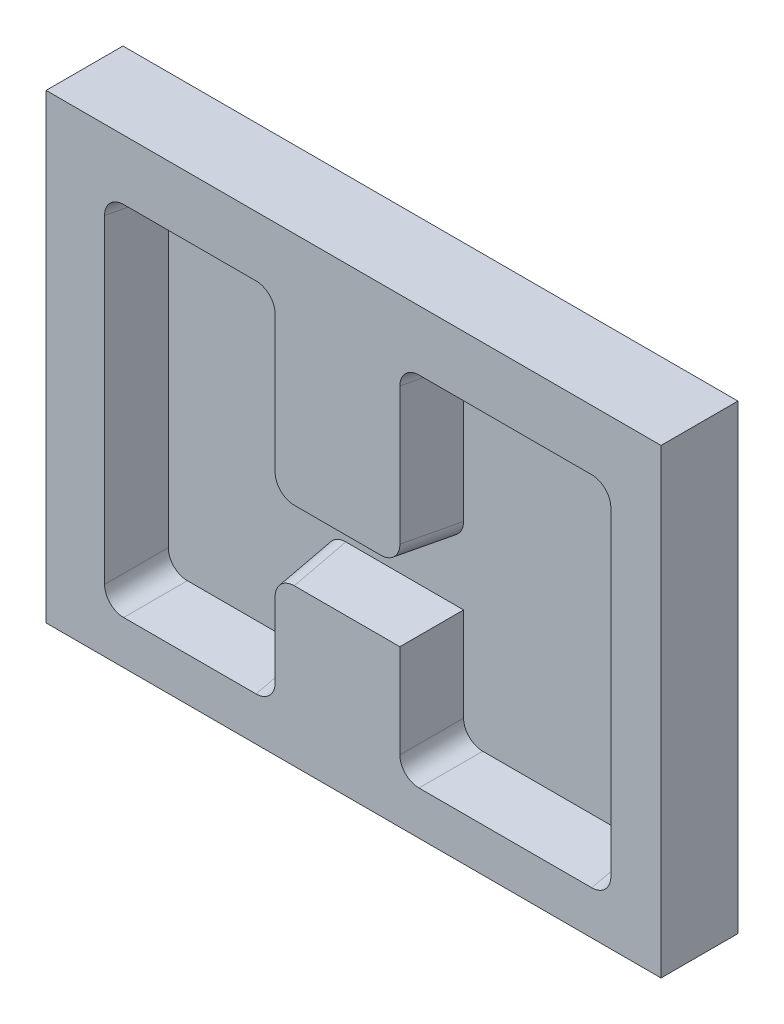
ISO-10303-21;
HEADER;
FILE_DESCRIPTION(('STEP AP214'),'2;1');
FILE_NAME('part.step','',(''),(''),'','','');
FILE_SCHEMA(('AUTOMOTIVE_DESIGN { 1 0 10303 214 1 1 1 1 }'));
ENDSEC;
DATA;
#1=APPLICATION_CONTEXT('core data for automotive mechanical design processes');
#2=APPLICATION_PROTOCOL_DEFINITION('international standard','automotive_design',2000,#1);
#3=PRODUCT_CONTEXT('',#1,'mechanical');
#4=PRODUCT('Part','Part','',(#3));
#5=PRODUCT_RELATED_PRODUCT_CATEGORY('part','',(#4));
#6=PRODUCT_DEFINITION_FORMATION('','',#4);
#7=PRODUCT_DEFINITION_CONTEXT('part definition',#1,'design');
#8=PRODUCT_DEFINITION('design','',#6,#7);
#9=PRODUCT_DEFINITION_SHAPE('','',#8);
#10=(LENGTH_UNIT() NAMED_UNIT(*) SI_UNIT(.MILLI.,.METRE.));
#11=(NAMED_UNIT(*) PLANE_ANGLE_UNIT() SI_UNIT($,.RADIAN.));
#12=(NAMED_UNIT(*) SI_UNIT($,.STERADIAN.) SOLID_ANGLE_UNIT());
#13=UNCERTAINTY_MEASURE_WITH_UNIT(LENGTH_MEASURE(1.E-05),#10,'distance_accuracy_value','');
#14=(GEOMETRIC_REPRESENTATION_CONTEXT(3) GLOBAL_UNCERTAINTY_ASSIGNED_CONTEXT((#13)) GLOBAL_UNIT_ASSIGNED_CONTEXT((#10,
#11,#12)) REPRESENTATION_CONTEXT('',''));
#15=CARTESIAN_POINT('',(0.,0.,0.));
#16=DIRECTION('',(0.,0.,1.));
#17=DIRECTION('',(1.,0.,0.));
#18=AXIS2_PLACEMENT_3D('',#15,#16,#17);
#19=CARTESIAN_POINT('',(0.,0.,25.4));
#20=DIRECTION('',(1.,0.,0.));
#21=DIRECTION('',(0.,0.,-1.));
#22=AXIS2_PLACEMENT_3D('',#19,#20,#21);
#23=PLANE('',#22);
#24=DIRECTION('',(0.,-1.,0.));
#25=VECTOR('',#24,1.);
#26=CARTESIAN_POINT('',(0.,0.,0.));
#27=LINE('',#26,#25);
#28=CARTESIAN_POINT('',(0.,152.4,0.));
#29=VERTEX_POINT('',#28);
#30=CARTESIAN_POINT('',(0.,0.,0.));
#31=VERTEX_POINT('',#30);
#32=EDGE_CURVE('E236',#29,#31,#27,.T.);
#33=ORIENTED_EDGE('',*,*,#32,.T.);
#34=DIRECTION('',(0.,0.,-1.));
#35=VECTOR('',#34,1.);
#36=CARTESIAN_POINT('',(0.,0.,25.4));
#37=LINE('',#36,#35);
#38=CARTESIAN_POINT('',(0.,0.,25.4));
#39=VERTEX_POINT('',#38);
#40=EDGE_CURVE('E324',#39,#31,#37,.T.);
#41=ORIENTED_EDGE('',*,*,#40,.F.);
#42=DIRECTION('',(0.,-1.,0.));
#43=VECTOR('',#42,1.);
#44=CARTESIAN_POINT('',(0.,0.,25.4));
#45=LINE('',#44,#43);
#46=CARTESIAN_POINT('',(0.,152.4,25.4));
#47=VERTEX_POINT('',#46);
#48=EDGE_CURVE('E306',#47,#39,#45,.T.);
#49=ORIENTED_EDGE('',*,*,#48,.F.);
#50=DIRECTION('',(0.,0.,-1.));
#51=VECTOR('',#50,1.);
#52=CARTESIAN_POINT('',(0.,152.4,25.4));
#53=LINE('',#52,#51);
#54=EDGE_CURVE('E315',#47,#29,#53,.T.);
#55=ORIENTED_EDGE('',*,*,#54,.T.);
#56=EDGE_LOOP('',(#33,#41,#49,#55));
#57=FACE_BOUND('',#56,.T.);
#58=ADVANCED_FACE('F38',(#57),#23,.F.);
#59=CARTESIAN_POINT('',(0.,0.,25.4));
#60=DIRECTION('',(0.,1.,0.));
#61=DIRECTION('',(0.,0.,1.));
#62=AXIS2_PLACEMENT_3D('',#59,#60,#61);
#63=PLANE('',#62);
#64=DIRECTION('',(1.,0.,0.));
#65=VECTOR('',#64,1.);
#66=CARTESIAN_POINT('',(0.,0.,0.));
#67=LINE('',#66,#65);
#68=CARTESIAN_POINT('',(203.2,0.,0.));
#69=VERTEX_POINT('',#68);
#70=EDGE_CURVE('E300',#31,#69,#67,.T.);
#71=ORIENTED_EDGE('',*,*,#70,.T.);
#72=DIRECTION('',(0.,0.,-1.));
#73=VECTOR('',#72,1.);
#74=CARTESIAN_POINT('',(203.2,0.,25.4));
#75=LINE('',#74,#73);
#76=CARTESIAN_POINT('',(203.2,0.,25.4));
#77=VERTEX_POINT('',#76);
#78=EDGE_CURVE('E321',#77,#69,#75,.T.);
#79=ORIENTED_EDGE('',*,*,#78,.F.);
#80=DIRECTION('',(1.,0.,0.));
#81=VECTOR('',#80,1.);
#82=CARTESIAN_POINT('',(0.,0.,25.4));
#83=LINE('',#82,#81);
#84=EDGE_CURVE('E309',#39,#77,#83,.T.);
#85=ORIENTED_EDGE('',*,*,#84,.F.);
#86=ORIENTED_EDGE('',*,*,#40,.T.);
#87=EDGE_LOOP('',(#71,#79,#85,#86));
#88=FACE_BOUND('',#87,.T.);
#89=ADVANCED_FACE('F510',(#88),#63,.F.);
#90=CARTESIAN_POINT('',(203.2,0.,25.4));
#91=DIRECTION('',(-1.,0.,0.));
#92=DIRECTION('',(0.,0.,1.));
#93=AXIS2_PLACEMENT_3D('',#90,#91,#92);
#94=PLANE('',#93);
#95=DIRECTION('',(0.,1.,0.));
#96=VECTOR('',#95,1.);
#97=CARTESIAN_POINT('',(203.2,0.,0.));
#98=LINE('',#97,#96);
#99=CARTESIAN_POINT('',(203.2,152.4,0.));
#100=VERTEX_POINT('',#99);
#101=EDGE_CURVE('E302',#69,#100,#98,.T.);
#102=ORIENTED_EDGE('',*,*,#101,.T.);
#103=DIRECTION('',(0.,0.,-1.));
#104=VECTOR('',#103,1.);
#105=CARTESIAN_POINT('',(203.2,152.4,25.4));
#106=LINE('',#105,#104);
#107=CARTESIAN_POINT('',(203.2,152.4,25.4));
#108=VERTEX_POINT('',#107);
#109=EDGE_CURVE('E318',#108,#100,#106,.T.);
#110=ORIENTED_EDGE('',*,*,#109,.F.);
#111=DIRECTION('',(0.,1.,0.));
#112=VECTOR('',#111,1.);
#113=CARTESIAN_POINT('',(203.2,0.,25.4));
#114=LINE('',#113,#112);
#115=EDGE_CURVE('E311',#77,#108,#114,.T.);
#116=ORIENTED_EDGE('',*,*,#115,.F.);
#117=ORIENTED_EDGE('',*,*,#78,.T.);
#118=EDGE_LOOP('',(#102,#110,#116,#117));
#119=FACE_BOUND('',#118,.T.);
#120=ADVANCED_FACE('F515',(#119),#94,.F.);
#121=CARTESIAN_POINT('',(0.,152.4,25.4));
#122=DIRECTION('',(0.,-1.,0.));
#123=DIRECTION('',(0.,0.,-1.));
#124=AXIS2_PLACEMENT_3D('',#121,#122,#123);
#125=PLANE('',#124);
#126=DIRECTION('',(-1.,0.,0.));
#127=VECTOR('',#126,1.);
#128=CARTESIAN_POINT('',(0.,152.4,0.));
#129=LINE('',#128,#127);
#130=EDGE_CURVE('E304',#100,#29,#129,.T.);
#131=ORIENTED_EDGE('',*,*,#130,.T.);
#132=ORIENTED_EDGE('',*,*,#54,.F.);
#133=DIRECTION('',(-1.,0.,0.));
#134=VECTOR('',#133,1.);
#135=CARTESIAN_POINT('',(0.,152.4,25.4));
#136=LINE('',#135,#134);
#137=EDGE_CURVE('E313',#108,#47,#136,.T.);
#138=ORIENTED_EDGE('',*,*,#137,.F.);
#139=ORIENTED_EDGE('',*,*,#109,.T.);
#140=EDGE_LOOP('',(#131,#132,#138,#139));
#141=FACE_BOUND('',#140,.T.);
#142=ADVANCED_FACE('F530',(#141),#125,.F.);
#143=CARTESIAN_POINT('',(0.,152.4,25.4));
#144=DIRECTION('',(0.,0.,-1.));
#145=DIRECTION('',(-1.,0.,0.));
#146=AXIS2_PLACEMENT_3D('',#143,#144,#145);
#147=PLANE('',#146);
#148=DIRECTION('',(1.,0.,0.));
#149=VECTOR('',#148,1.);
#150=CARTESIAN_POINT('',(116.904399701715,51.6523489932887,25.4));
#151=LINE('',#150,#149);
#152=CARTESIAN_POINT('',(82.0038046396154,51.6523489932887,25.4));
#153=VERTEX_POINT('',#152);
#154=CARTESIAN_POINT('',(116.904399701715,51.6523489932887,25.4));
#155=VERTEX_POINT('',#154);
#156=EDGE_CURVE('E218',#153,#155,#151,.T.);
#157=ORIENTED_EDGE('',*,*,#156,.F.);
#158=CARTESIAN_POINT('',(82.0735681792552,45.2673714180604,25.4));
#159=DIRECTION('',(0.,0.,-1.));
#160=DIRECTION('',(0.707106781186547,-0.707106781186548,0.));
#161=AXIS2_PLACEMENT_3D('',#158,#159,#160);
#162=ELLIPSE('',#161,6.41976458075662,6.35);
#163=CARTESIAN_POINT('',(75.6885906040269,45.3371349577002,25.4));
#164=VERTEX_POINT('',#163);
#165=EDGE_CURVE('E380',#153,#164,#162,.F.);
#166=ORIENTED_EDGE('',*,*,#165,.T.);
#167=DIRECTION('',(0.,1.,0.));
#168=VECTOR('',#167,1.);
#169=CARTESIAN_POINT('',(75.6885906040269,51.6523489932887,25.4));
#170=LINE('',#169,#168);
#171=CARTESIAN_POINT('',(75.6885906040269,20.6915003890562,25.4));
#172=VERTEX_POINT('',#171);
#173=EDGE_CURVE('E228',#172,#164,#170,.T.);
#174=ORIENTED_EDGE('',*,*,#173,.F.);
#175=CARTESIAN_POINT('',(69.3036130287986,20.761263928696,25.4));
#176=DIRECTION('',(0.,0.,-1.));
#177=DIRECTION('',(-0.707106781186548,0.707106781186547,0.));
#178=AXIS2_PLACEMENT_3D('',#175,#176,#177);
#179=ELLIPSE('',#178,6.41976458075662,6.35);
#180=CARTESIAN_POINT('',(69.3733765684383,14.3762863534677,25.4));
#181=VERTEX_POINT('',#180);
#182=EDGE_CURVE('E406',#172,#181,#179,.T.);
#183=ORIENTED_EDGE('',*,*,#182,.T.);
#184=DIRECTION('',(1.,0.,0.));
#185=VECTOR('',#184,1.);
#186=CARTESIAN_POINT('',(75.6885906040269,14.3762863534677,25.4));
#187=LINE('',#186,#185);
#188=CARTESIAN_POINT('',(25.6351245501299,14.3762863534677,25.4));
#189=VERTEX_POINT('',#188);
#190=EDGE_CURVE('E476',#189,#181,#187,.T.);
#191=ORIENTED_EDGE('',*,*,#190,.F.);
#192=CARTESIAN_POINT('',(25.7048880897697,20.761263928696,25.4));
#193=DIRECTION('',(0.,0.,-1.));
#194=DIRECTION('',(0.707106781186548,0.707106781186548,0.));
#195=AXIS2_PLACEMENT_3D('',#192,#193,#194);
#196=ELLIPSE('',#195,6.41976458075662,6.35);
#197=CARTESIAN_POINT('',(19.3199105145414,20.6915003890562,25.4));
#198=VERTEX_POINT('',#197);
#199=EDGE_CURVE('E404',#189,#198,#196,.T.);
#200=ORIENTED_EDGE('',*,*,#199,.T.);
#201=DIRECTION('',(0.,-1.,0.));
#202=VECTOR('',#201,1.);
#203=CARTESIAN_POINT('',(19.3199105145414,132.568680089486,25.4));
#204=LINE('',#203,#202);
#205=CARTESIAN_POINT('',(19.3199105145414,126.253466053897,25.4));
#206=VERTEX_POINT('',#205);
#207=EDGE_CURVE('E478',#206,#198,#204,.T.);
#208=ORIENTED_EDGE('',*,*,#207,.F.);
#209=CARTESIAN_POINT('',(25.7048880897697,126.183702514257,25.4));
#210=DIRECTION('',(0.,0.,-1.));
#211=DIRECTION('',(0.707106781186548,-0.707106781186548,0.));
#212=AXIS2_PLACEMENT_3D('',#209,#210,#211);
#213=ELLIPSE('',#212,6.41976458075662,6.35);
#214=CARTESIAN_POINT('',(25.6351245501299,132.568680089486,25.4));
#215=VERTEX_POINT('',#214);
#216=EDGE_CURVE('E11',#206,#215,#213,.T.);
#217=ORIENTED_EDGE('',*,*,#216,.T.);
#218=DIRECTION('',(-1.,0.,0.));
#219=VECTOR('',#218,1.);
#220=CARTESIAN_POINT('',(19.3199105145414,132.568680089486,25.4));
#221=LINE('',#220,#219);
#222=CARTESIAN_POINT('',(69.3733765684383,132.568680089486,25.4));
#223=VERTEX_POINT('',#222);
#224=EDGE_CURVE('E263',#223,#215,#221,.T.);
#225=ORIENTED_EDGE('',*,*,#224,.F.);
#226=CARTESIAN_POINT('',(69.3036130287985,126.183702514257,25.4));
#227=DIRECTION('',(0.,0.,-1.));
#228=DIRECTION('',(-0.707106781186548,-0.707106781186548,0.));
#229=AXIS2_PLACEMENT_3D('',#226,#227,#228);
#230=ELLIPSE('',#229,6.41976458075662,6.35);
#231=CARTESIAN_POINT('',(75.6885906040269,126.253466053897,25.4));
#232=VERTEX_POINT('',#231);
#233=EDGE_CURVE('E402',#223,#232,#230,.T.);
#234=ORIENTED_EDGE('',*,*,#233,.T.);
#235=DIRECTION('',(0.,1.,0.));
#236=VECTOR('',#235,1.);
#237=CARTESIAN_POINT('',(75.6885906040269,132.568680089486,25.4));
#238=LINE('',#237,#236);
#239=CARTESIAN_POINT('',(75.6885906040269,80.9999269364089,25.4));
#240=VERTEX_POINT('',#239);
#241=EDGE_CURVE('E260',#240,#232,#238,.T.);
#242=ORIENTED_EDGE('',*,*,#241,.F.);
#243=CARTESIAN_POINT('',(82.0735681792552,81.0696904760487,25.4));
#244=DIRECTION('',(0.,0.,-1.));
#245=DIRECTION('',(0.707106781186548,0.707106781186548,0.));
#246=AXIS2_PLACEMENT_3D('',#243,#244,#245);
#247=ELLIPSE('',#246,6.41976458075662,6.35);
#248=CARTESIAN_POINT('',(82.0038046396154,74.6847129008204,25.4));
#249=VERTEX_POINT('',#248);
#250=EDGE_CURVE('E376',#240,#249,#247,.F.);
#251=ORIENTED_EDGE('',*,*,#250,.T.);
#252=DIRECTION('',(-1.,0.,0.));
#253=VECTOR('',#252,1.);
#254=CARTESIAN_POINT('',(75.6885906040269,74.6847129008204,25.4));
#255=LINE('',#254,#253);
#256=CARTESIAN_POINT('',(110.589185666127,74.6847129008204,25.4));
#257=VERTEX_POINT('',#256);
#258=EDGE_CURVE('E257',#257,#249,#255,.T.);
#259=ORIENTED_EDGE('',*,*,#258,.F.);
#260=CARTESIAN_POINT('',(110.519422126487,81.0696904760487,25.4));
#261=DIRECTION('',(0.,0.,-1.));
#262=DIRECTION('',(-0.707106781186547,0.707106781186548,0.));
#263=AXIS2_PLACEMENT_3D('',#260,#261,#262);
#264=ELLIPSE('',#263,6.41976458075662,6.35);
#265=CARTESIAN_POINT('',(116.904399701715,80.9999269364089,25.4));
#266=VERTEX_POINT('',#265);
#267=EDGE_CURVE('E378',#257,#266,#264,.F.);
#268=ORIENTED_EDGE('',*,*,#267,.T.);
#269=DIRECTION('',(0.,-1.,0.));
#270=VECTOR('',#269,1.);
#271=CARTESIAN_POINT('',(116.904399701715,74.6847129008204,25.4));
#272=LINE('',#271,#270);
#273=CARTESIAN_POINT('',(116.904399701715,126.253466053897,25.4));
#274=VERTEX_POINT('',#273);
#275=EDGE_CURVE('E254',#274,#266,#272,.T.);
#276=ORIENTED_EDGE('',*,*,#275,.F.);
#277=CARTESIAN_POINT('',(123.289377276943,126.183702514257,25.4));
#278=DIRECTION('',(0.,0.,-1.));
#279=DIRECTION('',(0.707106781186547,-0.707106781186548,0.));
#280=AXIS2_PLACEMENT_3D('',#277,#278,#279);
#281=ELLIPSE('',#280,6.41976458075662,6.35);
#282=CARTESIAN_POINT('',(123.219613737304,132.568680089486,25.4));
#283=VERTEX_POINT('',#282);
#284=EDGE_CURVE('E412',#274,#283,#281,.T.);
#285=ORIENTED_EDGE('',*,*,#284,.T.);
#286=DIRECTION('',(-1.,0.,0.));
#287=VECTOR('',#286,1.);
#288=CARTESIAN_POINT('',(116.904399701715,132.568680089486,25.4));
#289=LINE('',#288,#287);
#290=CARTESIAN_POINT('',(180.292392228393,132.568680089486,25.4));
#291=VERTEX_POINT('',#290);
#292=EDGE_CURVE('E251',#291,#283,#289,.T.);
#293=ORIENTED_EDGE('',*,*,#292,.F.);
#294=CARTESIAN_POINT('',(180.222628688754,126.183702514257,25.4));
#295=DIRECTION('',(0.,0.,-1.));
#296=DIRECTION('',(-0.707106781186548,-0.707106781186548,0.));
#297=AXIS2_PLACEMENT_3D('',#294,#295,#296);
#298=ELLIPSE('',#297,6.41976458075662,6.35);
#299=CARTESIAN_POINT('',(186.607606263982,126.253466053897,25.4));
#300=VERTEX_POINT('',#299);
#301=EDGE_CURVE('E52',#291,#300,#298,.T.);
#302=ORIENTED_EDGE('',*,*,#301,.T.);
#303=DIRECTION('',(0.,1.,0.));
#304=VECTOR('',#303,1.);
#305=CARTESIAN_POINT('',(186.607606263982,132.568680089486,25.4));
#306=LINE('',#305,#304);
#307=CARTESIAN_POINT('',(186.607606263982,20.6915003890562,25.4));
#308=VERTEX_POINT('',#307);
#309=EDGE_CURVE('E246',#308,#300,#306,.T.);
#310=ORIENTED_EDGE('',*,*,#309,.F.);
#311=CARTESIAN_POINT('',(180.222628688754,20.761263928696,25.4));
#312=DIRECTION('',(0.,0.,-1.));
#313=DIRECTION('',(-0.707106781186548,0.707106781186548,0.));
#314=AXIS2_PLACEMENT_3D('',#311,#312,#313);
#315=ELLIPSE('',#314,6.41976458075662,6.35);
#316=CARTESIAN_POINT('',(180.292392228394,14.3762863534677,25.4));
#317=VERTEX_POINT('',#316);
#318=EDGE_CURVE('E60',#308,#317,#315,.T.);
#319=ORIENTED_EDGE('',*,*,#318,.T.);
#320=DIRECTION('',(1.,0.,0.));
#321=VECTOR('',#320,1.);
#322=CARTESIAN_POINT('',(186.607606263982,14.3762863534677,25.4));
#323=LINE('',#322,#321);
#324=CARTESIAN_POINT('',(123.219613737304,14.3762863534677,25.4));
#325=VERTEX_POINT('',#324);
#326=EDGE_CURVE('E243',#325,#317,#323,.T.);
#327=ORIENTED_EDGE('',*,*,#326,.F.);
#328=CARTESIAN_POINT('',(123.289377276943,20.761263928696,25.4));
#329=DIRECTION('',(0.,0.,-1.));
#330=DIRECTION('',(0.707106781186548,0.707106781186548,0.));
#331=AXIS2_PLACEMENT_3D('',#328,#329,#330);
#332=ELLIPSE('',#331,6.41976458075662,6.35);
#333=CARTESIAN_POINT('',(116.904399701715,20.6915003890562,25.4));
#334=VERTEX_POINT('',#333);
#335=EDGE_CURVE('E242',#325,#334,#332,.T.);
#336=ORIENTED_EDGE('',*,*,#335,.T.);
#337=DIRECTION('',(0.,-1.,0.));
#338=VECTOR('',#337,1.);
#339=CARTESIAN_POINT('',(116.904399701715,14.3762863534677,25.4));
#340=LINE('',#339,#338);
#341=EDGE_CURVE('E227',#155,#334,#340,.T.);
#342=ORIENTED_EDGE('',*,*,#341,.F.);
#343=EDGE_LOOP('',(#157,#166,#174,#183,#191,#200,#208,#217,#225,#234,#242,#251,#259,#268,#276,
#285,#293,#302,#310,#319,#327,#336,#342));
#344=FACE_BOUND('',#343,.T.);
#345=ORIENTED_EDGE('',*,*,#48,.T.);
#346=ORIENTED_EDGE('',*,*,#84,.T.);
#347=ORIENTED_EDGE('',*,*,#115,.T.);
#348=ORIENTED_EDGE('',*,*,#137,.T.);
#349=EDGE_LOOP('',(#345,#346,#347,#348));
#350=FACE_BOUND('',#349,.T.);
#351=ADVANCED_FACE('F239',(#344,#350),#147,.F.);
#352=CARTESIAN_POINT('',(0.,152.4,0.));
#353=DIRECTION('',(0.,0.,-1.));
#354=DIRECTION('',(-1.,0.,0.));
#355=AXIS2_PLACEMENT_3D('',#352,#353,#354);
#356=PLANE('',#355);
#357=ORIENTED_EDGE('',*,*,#32,.F.);
#358=ORIENTED_EDGE('',*,*,#130,.F.);
#359=ORIENTED_EDGE('',*,*,#101,.F.);
#360=ORIENTED_EDGE('',*,*,#70,.F.);
#361=EDGE_LOOP('',(#357,#358,#359,#360));
#362=FACE_BOUND('',#361,.T.);
#363=ADVANCED_FACE('F523',(#362),#356,.T.);
#364=CARTESIAN_POINT('',(19.3199105145414,132.568680089486,25.4));
#365=DIRECTION('',(-0.994521895368273,0.,-0.104528463267654));
#366=DIRECTION('',(-0.104528463267654,0.,0.994521895368273));
#367=AXIS2_PLACEMENT_3D('',#364,#365,#366);
#368=PLANE('',#367);
#369=ORIENTED_EDGE('',*,*,#207,.T.);
#370=DIRECTION('',(-0.103962051184498,-0.103962051184498,0.989132844377854));
#371=VECTOR('',#370,1.);
#372=CARTESIAN_POINT('',(21.2538906804666,22.6254805549814,6.99940785414988));
#373=LINE('',#372,#371);
#374=CARTESIAN_POINT('',(21.3221461963525,22.6937360708673,6.35));
#375=VERTEX_POINT('',#374);
#376=EDGE_CURVE('E368',#198,#375,#373,.F.);
#377=ORIENTED_EDGE('',*,*,#376,.T.);
#378=DIRECTION('',(0.,-1.,0.));
#379=VECTOR('',#378,1.);
#380=CARTESIAN_POINT('',(21.3221461963525,132.568680089486,6.35));
#381=LINE('',#380,#379);
#382=CARTESIAN_POINT('',(21.3221461963525,124.251230372086,6.35));
#383=VERTEX_POINT('',#382);
#384=EDGE_CURVE('E265',#383,#375,#381,.T.);
#385=ORIENTED_EDGE('',*,*,#384,.F.);
#386=DIRECTION('',(-0.103962051184498,0.103962051184498,0.989132844377854));
#387=VECTOR('',#386,1.);
#388=CARTESIAN_POINT('',(19.2516549986555,126.321721569783,26.0494078541499));
#389=LINE('',#388,#387);
#390=EDGE_CURVE('E365',#383,#206,#389,.T.);
#391=ORIENTED_EDGE('',*,*,#390,.T.);
#392=EDGE_LOOP('',(#369,#377,#385,#391));
#393=FACE_BOUND('',#392,.T.);
#394=ADVANCED_FACE('F485',(#393),#368,.F.);
#395=CARTESIAN_POINT('',(19.3199105145414,132.568680089486,25.4));
#396=DIRECTION('',(0.,0.994521895368273,-0.104528463267654));
#397=DIRECTION('',(0.,0.104528463267654,0.994521895368273));
#398=AXIS2_PLACEMENT_3D('',#395,#396,#397);
#399=PLANE('',#398);
#400=DIRECTION('',(-1.,0.,0.));
#401=VECTOR('',#400,1.);
#402=CARTESIAN_POINT('',(19.3199105145414,130.566444407674,6.35));
#403=LINE('',#402,#401);
#404=CARTESIAN_POINT('',(67.3711408866272,130.566444407674,6.35));
#405=VERTEX_POINT('',#404);
#406=CARTESIAN_POINT('',(27.6373602319411,130.566444407674,6.35));
#407=VERTEX_POINT('',#406);
#408=EDGE_CURVE('E237',#405,#407,#403,.T.);
#409=ORIENTED_EDGE('',*,*,#408,.F.);
#410=DIRECTION('',(0.103962051184498,0.103962051184498,0.989132844377854));
#411=VECTOR('',#410,1.);
#412=CARTESIAN_POINT('',(69.4416320843243,132.636935605371,26.0494078541499));
#413=LINE('',#412,#411);
#414=EDGE_CURVE('E352',#405,#223,#413,.T.);
#415=ORIENTED_EDGE('',*,*,#414,.T.);
#416=ORIENTED_EDGE('',*,*,#224,.T.);
#417=DIRECTION('',(-0.103962051184498,0.103962051184498,0.989132844377854));
#418=VECTOR('',#417,1.);
#419=CARTESIAN_POINT('',(27.5691047160551,130.63469992356,6.99940785414988));
#420=LINE('',#419,#418);
#421=EDGE_CURVE('E350',#215,#407,#420,.F.);
#422=ORIENTED_EDGE('',*,*,#421,.T.);
#423=EDGE_LOOP('',(#409,#415,#416,#422));
#424=FACE_BOUND('',#423,.T.);
#425=ADVANCED_FACE('F543',(#424),#399,.F.);
#426=CARTESIAN_POINT('',(75.6885906040269,132.568680089486,25.4));
#427=DIRECTION('',(0.994521895368273,0.,-0.104528463267654));
#428=DIRECTION('',(-0.104528463267654,0.,-0.994521895368273));
#429=AXIS2_PLACEMENT_3D('',#426,#427,#428);
#430=PLANE('',#429);
#431=ORIENTED_EDGE('',*,*,#241,.T.);
#432=DIRECTION('',(0.103962051184498,0.103962051184498,0.989132844377854));
#433=VECTOR('',#432,1.);
#434=CARTESIAN_POINT('',(73.7546104381017,124.319485887972,6.99940785414988));
#435=LINE('',#434,#433);
#436=CARTESIAN_POINT('',(73.6863549222157,124.251230372086,6.35));
#437=VERTEX_POINT('',#436);
#438=EDGE_CURVE('E358',#232,#437,#435,.F.);
#439=ORIENTED_EDGE('',*,*,#438,.T.);
#440=DIRECTION('',(0.,1.,0.));
#441=VECTOR('',#440,1.);
#442=CARTESIAN_POINT('',(73.6863549222157,132.568680089486,6.35));
#443=LINE('',#442,#441);
#444=CARTESIAN_POINT('',(73.6863549222157,78.9976912545978,6.35));
#445=VERTEX_POINT('',#444);
#446=EDGE_CURVE('E272',#445,#437,#443,.T.);
#447=ORIENTED_EDGE('',*,*,#446,.F.);
#448=DIRECTION('',(0.103962051184498,0.103962051184498,0.989132844377854));
#449=VECTOR('',#448,1.);
#450=CARTESIAN_POINT('',(76.2459512619907,81.5572875943728,30.7029324323136));
#451=LINE('',#450,#449);
#452=EDGE_CURVE('E355',#445,#240,#451,.T.);
#453=ORIENTED_EDGE('',*,*,#452,.T.);
#454=EDGE_LOOP('',(#431,#439,#447,#453));
#455=FACE_BOUND('',#454,.T.);
#456=ADVANCED_FACE('F425',(#455),#430,.F.);
#457=CARTESIAN_POINT('',(75.6885906040269,74.6847129008204,25.4));
#458=DIRECTION('',(0.,0.994521895368273,-0.104528463267654));
#459=DIRECTION('',(0.,0.104528463267654,0.994521895368273));
#460=AXIS2_PLACEMENT_3D('',#457,#458,#459);
#461=PLANE('',#460);
#462=DIRECTION('',(-1.,0.,0.));
#463=VECTOR('',#462,1.);
#464=CARTESIAN_POINT('',(75.6885906040269,72.6824772190092,6.35));
#465=LINE('',#464,#463);
#466=CARTESIAN_POINT('',(112.591421347938,72.6824772190092,6.35));
#467=VERTEX_POINT('',#466);
#468=CARTESIAN_POINT('',(80.0015689578043,72.6824772190092,6.35));
#469=VERTEX_POINT('',#468);
#470=EDGE_CURVE('E275',#467,#469,#465,.T.);
#471=ORIENTED_EDGE('',*,*,#470,.F.);
#472=DIRECTION('',(-0.103962051184498,0.103962051184498,0.989132844377854));
#473=VECTOR('',#472,1.);
#474=CARTESIAN_POINT('',(110.211976262413,75.0619223045343,28.9889077424943));
#475=LINE('',#474,#473);
#476=EDGE_CURVE('E398',#467,#257,#475,.T.);
#477=ORIENTED_EDGE('',*,*,#476,.T.);
#478=ORIENTED_EDGE('',*,*,#258,.T.);
#479=DIRECTION('',(0.103962051184498,0.103962051184498,0.989132844377854));
#480=VECTOR('',#479,1.);
#481=CARTESIAN_POINT('',(81.9355491237294,74.6164573849344,24.7505921458501));
#482=LINE('',#481,#480);
#483=EDGE_CURVE('E396',#249,#469,#482,.F.);
#484=ORIENTED_EDGE('',*,*,#483,.T.);
#485=EDGE_LOOP('',(#471,#477,#478,#484));
#486=FACE_BOUND('',#485,.T.);
#487=ADVANCED_FACE('F431',(#486),#461,.F.);
#488=CARTESIAN_POINT('',(116.904399701715,74.6847129008204,25.4));
#489=DIRECTION('',(-0.994521895368273,0.,-0.104528463267654));
#490=DIRECTION('',(-0.104528463267654,0.,0.994521895368273));
#491=AXIS2_PLACEMENT_3D('',#488,#489,#490);
#492=PLANE('',#491);
#493=DIRECTION('',(0.,-1.,0.));
#494=VECTOR('',#493,1.);
#495=CARTESIAN_POINT('',(118.906635383526,74.6847129008204,6.35));
#496=LINE('',#495,#494);
#497=CARTESIAN_POINT('',(118.906635383526,124.251230372086,6.35));
#498=VERTEX_POINT('',#497);
#499=CARTESIAN_POINT('',(118.906635383526,78.9976912545978,6.35));
#500=VERTEX_POINT('',#499);
#501=EDGE_CURVE('E278',#498,#500,#496,.T.);
#502=ORIENTED_EDGE('',*,*,#501,.F.);
#503=DIRECTION('',(-0.103962051184498,0.103962051184498,0.989132844377854));
#504=VECTOR('',#503,1.);
#505=CARTESIAN_POINT('',(116.836144185829,126.321721569783,26.0494078541499));
#506=LINE('',#505,#504);
#507=EDGE_CURVE('E393',#498,#274,#506,.T.);
#508=ORIENTED_EDGE('',*,*,#507,.T.);
#509=ORIENTED_EDGE('',*,*,#275,.T.);
#510=DIRECTION('',(-0.103962051184498,0.103962051184498,0.989132844377854));
#511=VECTOR('',#510,1.);
#512=CARTESIAN_POINT('',(116.972655217601,80.931671420523,24.7505921458501));
#513=LINE('',#512,#511);
#514=EDGE_CURVE('E391',#266,#500,#513,.F.);
#515=ORIENTED_EDGE('',*,*,#514,.T.);
#516=EDGE_LOOP('',(#502,#508,#509,#515));
#517=FACE_BOUND('',#516,.T.);
#518=ADVANCED_FACE('F440',(#517),#492,.F.);
#519=CARTESIAN_POINT('',(116.904399701715,132.568680089486,25.4));
#520=DIRECTION('',(0.,0.994521895368273,-0.104528463267654));
#521=DIRECTION('',(0.,0.104528463267654,0.994521895368273));
#522=AXIS2_PLACEMENT_3D('',#519,#520,#521);
#523=PLANE('',#522);
#524=DIRECTION('',(-1.,0.,0.));
#525=VECTOR('',#524,1.);
#526=CARTESIAN_POINT('',(116.904399701715,130.566444407674,6.35));
#527=LINE('',#526,#525);
#528=CARTESIAN_POINT('',(178.290156546582,130.566444407674,6.35));
#529=VERTEX_POINT('',#528);
#530=CARTESIAN_POINT('',(125.221849419115,130.566444407674,6.35));
#531=VERTEX_POINT('',#530);
#532=EDGE_CURVE('E281',#529,#531,#527,.T.);
#533=ORIENTED_EDGE('',*,*,#532,.F.);
#534=DIRECTION('',(0.103962051184498,0.103962051184498,0.989132844377854));
#535=VECTOR('',#534,1.);
#536=CARTESIAN_POINT('',(180.360647744279,132.636935605371,26.0494078541499));
#537=LINE('',#536,#535);
#538=EDGE_CURVE('E388',#529,#291,#537,.T.);
#539=ORIENTED_EDGE('',*,*,#538,.T.);
#540=ORIENTED_EDGE('',*,*,#292,.T.);
#541=DIRECTION('',(-0.103962051184498,0.103962051184498,0.989132844377854));
#542=VECTOR('',#541,1.);
#543=CARTESIAN_POINT('',(125.153593903229,130.63469992356,6.99940785414988));
#544=LINE('',#543,#542);
#545=EDGE_CURVE('E386',#283,#531,#544,.F.);
#546=ORIENTED_EDGE('',*,*,#545,.T.);
#547=EDGE_LOOP('',(#533,#539,#540,#546));
#548=FACE_BOUND('',#547,.T.);
#549=ADVANCED_FACE('F448',(#548),#523,.F.);
#550=CARTESIAN_POINT('',(186.607606263982,132.568680089486,25.4));
#551=DIRECTION('',(0.994521895368273,0.,-0.104528463267654));
#552=DIRECTION('',(-0.104528463267654,0.,-0.994521895368273));
#553=AXIS2_PLACEMENT_3D('',#550,#551,#552);
#554=PLANE('',#553);
#555=DIRECTION('',(0.,1.,0.));
#556=VECTOR('',#555,1.);
#557=CARTESIAN_POINT('',(184.605370582171,132.568680089486,6.35));
#558=LINE('',#557,#556);
#559=CARTESIAN_POINT('',(184.605370582171,22.6937360708674,6.35));
#560=VERTEX_POINT('',#559);
#561=CARTESIAN_POINT('',(184.605370582171,124.251230372086,6.35));
#562=VERTEX_POINT('',#561);
#563=EDGE_CURVE('E284',#560,#562,#558,.T.);
#564=ORIENTED_EDGE('',*,*,#563,.F.);
#565=DIRECTION('',(0.103962051184498,-0.103962051184498,0.989132844377854));
#566=VECTOR('',#565,1.);
#567=CARTESIAN_POINT('',(186.675861779868,20.6232448731703,26.0494078541499));
#568=LINE('',#567,#566);
#569=EDGE_CURVE('E384',#560,#308,#568,.T.);
#570=ORIENTED_EDGE('',*,*,#569,.T.);
#571=ORIENTED_EDGE('',*,*,#309,.T.);
#572=DIRECTION('',(0.103962051184498,0.103962051184498,0.989132844377854));
#573=VECTOR('',#572,1.);
#574=CARTESIAN_POINT('',(184.673626098057,124.319485887972,6.99940785414988));
#575=LINE('',#574,#573);
#576=EDGE_CURVE('E382',#300,#562,#575,.F.);
#577=ORIENTED_EDGE('',*,*,#576,.T.);
#578=EDGE_LOOP('',(#564,#570,#571,#577));
#579=FACE_BOUND('',#578,.T.);
#580=ADVANCED_FACE('F456',(#579),#554,.F.);
#581=CARTESIAN_POINT('',(186.607606263982,14.3762863534677,25.4));
#582=DIRECTION('',(0.,-0.994521895368273,-0.104528463267654));
#583=DIRECTION('',(0.,0.104528463267654,-0.994521895368273));
#584=AXIS2_PLACEMENT_3D('',#581,#582,#583);
#585=PLANE('',#584);
#586=DIRECTION('',(1.,0.,0.));
#587=VECTOR('',#586,1.);
#588=CARTESIAN_POINT('',(186.607606263982,16.3785220352788,6.35));
#589=LINE('',#588,#587);
#590=CARTESIAN_POINT('',(125.221849419115,16.3785220352788,6.35));
#591=VERTEX_POINT('',#590);
#592=CARTESIAN_POINT('',(178.290156546582,16.3785220352788,6.35));
#593=VERTEX_POINT('',#592);
#594=EDGE_CURVE('E287',#591,#593,#589,.T.);
#595=ORIENTED_EDGE('',*,*,#594,.F.);
#596=DIRECTION('',(-0.103962051184498,-0.103962051184498,0.989132844377854));
#597=VECTOR('',#596,1.);
#598=CARTESIAN_POINT('',(123.151358221418,14.3080308375817,26.0494078541499));
#599=LINE('',#598,#597);
#600=EDGE_CURVE('E329',#591,#325,#599,.T.);
#601=ORIENTED_EDGE('',*,*,#600,.T.);
#602=ORIENTED_EDGE('',*,*,#326,.T.);
#603=DIRECTION('',(0.103962051184498,-0.103962051184498,0.989132844377854));
#604=VECTOR('',#603,1.);
#605=CARTESIAN_POINT('',(178.358412062468,16.3102665193929,6.99940785414988));
#606=LINE('',#605,#604);
#607=EDGE_CURVE('E327',#317,#593,#606,.F.);
#608=ORIENTED_EDGE('',*,*,#607,.T.);
#609=EDGE_LOOP('',(#595,#601,#602,#608));
#610=FACE_BOUND('',#609,.T.);
#611=ADVANCED_FACE('F461',(#610),#585,.F.);
#612=CARTESIAN_POINT('',(116.904399701715,14.3762863534677,25.4));
#613=DIRECTION('',(-0.994521895368273,0.,-0.104528463267654));
#614=DIRECTION('',(-0.104528463267654,0.,0.994521895368273));
#615=AXIS2_PLACEMENT_3D('',#612,#613,#614);
#616=PLANE('',#615);
#617=ORIENTED_EDGE('',*,*,#341,.T.);
#618=DIRECTION('',(-0.103962051184498,-0.103962051184498,0.989132844377854));
#619=VECTOR('',#618,1.);
#620=CARTESIAN_POINT('',(118.83837986764,22.6254805549814,6.99940785414988));
#621=LINE('',#620,#619);
#622=CARTESIAN_POINT('',(118.906635383526,22.6937360708673,6.35));
#623=VERTEX_POINT('',#622);
#624=EDGE_CURVE('E332',#334,#623,#621,.F.);
#625=ORIENTED_EDGE('',*,*,#624,.T.);
#626=DIRECTION('',(0.,-1.,0.));
#627=VECTOR('',#626,1.);
#628=CARTESIAN_POINT('',(118.906635383526,14.3762863534677,6.35));
#629=LINE('',#628,#627);
#630=CARTESIAN_POINT('',(118.906635383526,53.6545846750998,6.35));
#631=VERTEX_POINT('',#630);
#632=EDGE_CURVE('E235',#631,#623,#629,.T.);
#633=ORIENTED_EDGE('',*,*,#632,.F.);
#634=DIRECTION('',(-0.103962051184498,-0.103962051184498,0.989132844377854));
#635=VECTOR('',#634,1.);
#636=CARTESIAN_POINT('',(116.501515987665,51.2494652792388,29.2331824881414));
#637=LINE('',#636,#635);
#638=EDGE_CURVE('E222',#631,#155,#637,.T.);
#639=ORIENTED_EDGE('',*,*,#638,.T.);
#640=EDGE_LOOP('',(#617,#625,#633,#639));
#641=FACE_BOUND('',#640,.T.);
#642=ADVANCED_FACE('F232',(#641),#616,.F.);
#643=CARTESIAN_POINT('',(116.904399701715,51.6523489932887,25.4));
#644=DIRECTION('',(0.,-0.994521895368273,-0.104528463267654));
#645=DIRECTION('',(0.,0.104528463267654,-0.994521895368273));
#646=AXIS2_PLACEMENT_3D('',#643,#644,#645);
#647=PLANE('',#646);
#648=DIRECTION('',(1.,0.,0.));
#649=VECTOR('',#648,1.);
#650=CARTESIAN_POINT('',(116.904399701715,53.6545846750998,6.35));
#651=LINE('',#650,#649);
#652=CARTESIAN_POINT('',(80.0015689578043,53.6545846750999,6.35));
#653=VERTEX_POINT('',#652);
#654=EDGE_CURVE('E291',#653,#631,#651,.T.);
#655=ORIENTED_EDGE('',*,*,#654,.F.);
#656=DIRECTION('',(0.103962051184498,-0.103962051184498,0.989132844377854));
#657=VECTOR('',#656,1.);
#658=CARTESIAN_POINT('',(82.3810140433293,51.2751395895748,28.9889077424943));
#659=LINE('',#658,#657);
#660=EDGE_CURVE('E225',#653,#153,#659,.T.);
#661=ORIENTED_EDGE('',*,*,#660,.T.);
#662=ORIENTED_EDGE('',*,*,#156,.T.);
#663=ORIENTED_EDGE('',*,*,#638,.F.);
#664=EDGE_LOOP('',(#655,#661,#662,#663));
#665=FACE_BOUND('',#664,.T.);
#666=ADVANCED_FACE('F221',(#665),#647,.F.);
#667=CARTESIAN_POINT('',(75.6885906040269,51.6523489932887,25.4));
#668=DIRECTION('',(0.994521895368273,0.,-0.104528463267654));
#669=DIRECTION('',(-0.104528463267654,0.,-0.994521895368273));
#670=AXIS2_PLACEMENT_3D('',#667,#668,#669);
#671=PLANE('',#670);
#672=DIRECTION('',(0.,1.,0.));
#673=VECTOR('',#672,1.);
#674=CARTESIAN_POINT('',(73.6863549222157,51.6523489932887,6.35));
#675=LINE('',#674,#673);
#676=CARTESIAN_POINT('',(73.6863549222157,22.6937360708673,6.35));
#677=VERTEX_POINT('',#676);
#678=CARTESIAN_POINT('',(73.6863549222157,47.3393706395113,6.35));
#679=VERTEX_POINT('',#678);
#680=EDGE_CURVE('E293',#677,#679,#675,.T.);
#681=ORIENTED_EDGE('',*,*,#680,.F.);
#682=DIRECTION('',(0.103962051184498,-0.103962051184498,0.989132844377854));
#683=VECTOR('',#682,1.);
#684=CARTESIAN_POINT('',(75.7568461199128,20.6232448731703,26.0494078541499));
#685=LINE('',#684,#683);
#686=EDGE_CURVE('E372',#677,#172,#685,.T.);
#687=ORIENTED_EDGE('',*,*,#686,.T.);
#688=ORIENTED_EDGE('',*,*,#173,.T.);
#689=DIRECTION('',(0.103962051184498,-0.103962051184498,0.989132844377854));
#690=VECTOR('',#689,1.);
#691=CARTESIAN_POINT('',(75.6203350881409,45.4053904735861,24.7505921458501));
#692=LINE('',#691,#690);
#693=EDGE_CURVE('E370',#164,#679,#692,.F.);
#694=ORIENTED_EDGE('',*,*,#693,.T.);
#695=EDGE_LOOP('',(#681,#687,#688,#694));
#696=FACE_BOUND('',#695,.T.);
#697=ADVANCED_FACE('F474',(#696),#671,.F.);
#698=CARTESIAN_POINT('',(75.6885906040269,14.3762863534677,25.4));
#699=DIRECTION('',(0.,-0.994521895368273,-0.104528463267654));
#700=DIRECTION('',(0.,0.104528463267654,-0.994521895368273));
#701=AXIS2_PLACEMENT_3D('',#698,#699,#700);
#702=PLANE('',#701);
#703=DIRECTION('',(1.,0.,0.));
#704=VECTOR('',#703,1.);
#705=CARTESIAN_POINT('',(75.6885906040269,16.3785220352788,6.35));
#706=LINE('',#705,#704);
#707=CARTESIAN_POINT('',(27.6373602319411,16.3785220352788,6.35));
#708=VERTEX_POINT('',#707);
#709=CARTESIAN_POINT('',(67.3711408866272,16.3785220352788,6.35));
#710=VERTEX_POINT('',#709);
#711=EDGE_CURVE('E269',#708,#710,#706,.T.);
#712=ORIENTED_EDGE('',*,*,#711,.F.);
#713=DIRECTION('',(-0.103962051184498,-0.103962051184498,0.989132844377854));
#714=VECTOR('',#713,1.);
#715=CARTESIAN_POINT('',(25.566869034244,14.3080308375817,26.0494078541499));
#716=LINE('',#715,#714);
#717=EDGE_CURVE('E362',#708,#189,#716,.T.);
#718=ORIENTED_EDGE('',*,*,#717,.T.);
#719=ORIENTED_EDGE('',*,*,#190,.T.);
#720=DIRECTION('',(0.103962051184498,-0.103962051184498,0.989132844377854));
#721=VECTOR('',#720,1.);
#722=CARTESIAN_POINT('',(67.4393964025131,16.3102665193929,6.99940785414989));
#723=LINE('',#722,#721);
#724=EDGE_CURVE('E360',#181,#710,#723,.F.);
#725=ORIENTED_EDGE('',*,*,#724,.T.);
#726=EDGE_LOOP('',(#712,#718,#719,#725));
#727=FACE_BOUND('',#726,.T.);
#728=ADVANCED_FACE('F495',(#727),#702,.F.);
#729=CARTESIAN_POINT('',(19.3199105145414,14.3762863534677,6.35));
#730=DIRECTION('',(0.,0.,-1.));
#731=DIRECTION('',(-1.,0.,0.));
#732=AXIS2_PLACEMENT_3D('',#729,#730,#731);
#733=PLANE('',#732);
#734=ORIENTED_EDGE('',*,*,#632,.T.);
#735=CARTESIAN_POINT('',(125.291612958755,22.7634996105071,6.35));
#736=DIRECTION('',(0.,0.,-1.));
#737=DIRECTION('',(0.707106781186548,0.707106781186548,0.));
#738=AXIS2_PLACEMENT_3D('',#735,#736,#737);
#739=ELLIPSE('',#738,6.41976458075662,6.35);
#740=EDGE_CURVE('E348',#623,#591,#739,.F.);
#741=ORIENTED_EDGE('',*,*,#740,.T.);
#742=ORIENTED_EDGE('',*,*,#594,.T.);
#743=CARTESIAN_POINT('',(178.220393006943,22.7634996105071,6.35));
#744=DIRECTION('',(0.,0.,-1.));
#745=DIRECTION('',(-0.707106781186548,0.707106781186548,0.));
#746=AXIS2_PLACEMENT_3D('',#743,#744,#745);
#747=ELLIPSE('',#746,6.41976458075662,6.35);
#748=EDGE_CURVE('E340',#593,#560,#747,.F.);
#749=ORIENTED_EDGE('',*,*,#748,.T.);
#750=ORIENTED_EDGE('',*,*,#563,.T.);
#751=CARTESIAN_POINT('',(178.220393006943,124.181466832446,6.35));
#752=DIRECTION('',(0.,0.,-1.));
#753=DIRECTION('',(-0.707106781186548,-0.707106781186548,0.));
#754=AXIS2_PLACEMENT_3D('',#751,#752,#753);
#755=ELLIPSE('',#754,6.41976458075662,6.35);
#756=EDGE_CURVE('E338',#562,#529,#755,.F.);
#757=ORIENTED_EDGE('',*,*,#756,.T.);
#758=ORIENTED_EDGE('',*,*,#532,.T.);
#759=CARTESIAN_POINT('',(125.291612958755,124.181466832446,6.35));
#760=DIRECTION('',(0.,0.,-1.));
#761=DIRECTION('',(0.707106781186547,-0.707106781186548,0.));
#762=AXIS2_PLACEMENT_3D('',#759,#760,#761);
#763=ELLIPSE('',#762,6.41976458075662,6.35);
#764=EDGE_CURVE('E336',#531,#498,#763,.F.);
#765=ORIENTED_EDGE('',*,*,#764,.T.);
#766=ORIENTED_EDGE('',*,*,#501,.T.);
#767=CARTESIAN_POINT('',(112.521657808298,79.0674547942376,6.35));
#768=DIRECTION('',(0.,0.,-1.));
#769=DIRECTION('',(-0.707106781186547,0.707106781186548,0.));
#770=AXIS2_PLACEMENT_3D('',#767,#768,#769);
#771=ELLIPSE('',#770,6.41976458075662,6.35);
#772=EDGE_CURVE('E414',#500,#467,#771,.T.);
#773=ORIENTED_EDGE('',*,*,#772,.T.);
#774=ORIENTED_EDGE('',*,*,#470,.T.);
#775=CARTESIAN_POINT('',(80.071332497444,79.0674547942375,6.35));
#776=DIRECTION('',(0.,0.,-1.));
#777=DIRECTION('',(0.707106781186548,0.707106781186548,0.));
#778=AXIS2_PLACEMENT_3D('',#775,#776,#777);
#779=ELLIPSE('',#778,6.41976458075662,6.35);
#780=EDGE_CURVE('E45',#469,#445,#779,.T.);
#781=ORIENTED_EDGE('',*,*,#780,.T.);
#782=ORIENTED_EDGE('',*,*,#446,.T.);
#783=CARTESIAN_POINT('',(67.3013773469874,124.181466832446,6.35));
#784=DIRECTION('',(0.,0.,-1.));
#785=DIRECTION('',(-0.707106781186548,-0.707106781186548,0.));
#786=AXIS2_PLACEMENT_3D('',#783,#784,#785);
#787=ELLIPSE('',#786,6.41976458075662,6.35);
#788=EDGE_CURVE('E346',#437,#405,#787,.F.);
#789=ORIENTED_EDGE('',*,*,#788,.T.);
#790=ORIENTED_EDGE('',*,*,#408,.T.);
#791=CARTESIAN_POINT('',(27.7071237715809,124.181466832446,6.35));
#792=DIRECTION('',(0.,0.,-1.));
#793=DIRECTION('',(0.707106781186548,-0.707106781186548,0.));
#794=AXIS2_PLACEMENT_3D('',#791,#792,#793);
#795=ELLIPSE('',#794,6.41976458075662,6.35);
#796=EDGE_CURVE('E334',#407,#383,#795,.F.);
#797=ORIENTED_EDGE('',*,*,#796,.T.);
#798=ORIENTED_EDGE('',*,*,#384,.T.);
#799=CARTESIAN_POINT('',(27.7071237715809,22.7634996105071,6.35));
#800=DIRECTION('',(0.,0.,-1.));
#801=DIRECTION('',(0.707106781186548,0.707106781186548,0.));
#802=AXIS2_PLACEMENT_3D('',#799,#800,#801);
#803=ELLIPSE('',#802,6.41976458075662,6.35);
#804=EDGE_CURVE('E344',#375,#708,#803,.F.);
#805=ORIENTED_EDGE('',*,*,#804,.T.);
#806=ORIENTED_EDGE('',*,*,#711,.T.);
#807=CARTESIAN_POINT('',(67.3013773469874,22.7634996105071,6.35));
#808=DIRECTION('',(0.,0.,-1.));
#809=DIRECTION('',(-0.707106781186548,0.707106781186547,0.));
#810=AXIS2_PLACEMENT_3D('',#807,#808,#809);
#811=ELLIPSE('',#810,6.41976458075662,6.35);
#812=EDGE_CURVE('E342',#710,#677,#811,.F.);
#813=ORIENTED_EDGE('',*,*,#812,.T.);
#814=ORIENTED_EDGE('',*,*,#680,.T.);
#815=CARTESIAN_POINT('',(80.071332497444,47.2696070998715,6.35));
#816=DIRECTION('',(0.,0.,-1.));
#817=DIRECTION('',(0.707106781186547,-0.707106781186548,0.));
#818=AXIS2_PLACEMENT_3D('',#815,#816,#817);
#819=ELLIPSE('',#818,6.41976458075662,6.35);
#820=EDGE_CURVE('E408',#679,#653,#819,.T.);
#821=ORIENTED_EDGE('',*,*,#820,.T.);
#822=ORIENTED_EDGE('',*,*,#654,.T.);
#823=EDGE_LOOP('',(#734,#741,#742,#749,#750,#757,#758,#765,#766,#773,#774,#781,#782,#789,#790,
#797,#798,#805,#806,#813,#814,#821,#822));
#824=FACE_BOUND('',#823,.T.);
#825=ADVANCED_FACE('F418',(#824),#733,.F.);
#826=CARTESIAN_POINT('',(123.904718011918,21.37660466367,19.5454239839277));
#827=DIRECTION('',(0.103962051184498,0.103962051184498,-0.989132844377854));
#828=DIRECTION('',(0.,0.994521895368273,0.104528463267654));
#829=AXIS2_PLACEMENT_3D('',#826,#827,#828);
#830=CYLINDRICAL_SURFACE('',#829,6.35);
#831=ORIENTED_EDGE('',*,*,#740,.F.);
#832=ORIENTED_EDGE('',*,*,#624,.F.);
#833=ORIENTED_EDGE('',*,*,#335,.F.);
#834=ORIENTED_EDGE('',*,*,#600,.F.);
#835=EDGE_LOOP('',(#831,#832,#833,#834));
#836=FACE_BOUND('',#835,.T.);
#837=ADVANCED_FACE('F465',(#836),#830,.F.);
#838=CARTESIAN_POINT('',(68.8323932972244,125.712482782683,20.9166437357832));
#839=DIRECTION('',(-0.103962051184498,-0.103962051184498,-0.989132844377854));
#840=DIRECTION('',(-0.994521895368273,0.,0.104528463267654));
#841=AXIS2_PLACEMENT_3D('',#838,#839,#840);
#842=CYLINDRICAL_SURFACE('',#841,6.35);
#843=ORIENTED_EDGE('',*,*,#788,.F.);
#844=ORIENTED_EDGE('',*,*,#438,.F.);
#845=ORIENTED_EDGE('',*,*,#233,.F.);
#846=ORIENTED_EDGE('',*,*,#414,.F.);
#847=EDGE_LOOP('',(#843,#844,#845,#846));
#848=FACE_BOUND('',#847,.T.);
#849=ADVANCED_FACE('F507',(#848),#842,.F.);
#850=CARTESIAN_POINT('',(26.1761078213438,21.2324836602701,20.9166437357832));
#851=DIRECTION('',(0.103962051184498,0.103962051184498,-0.989132844377854));
#852=DIRECTION('',(0.,0.994521895368273,0.104528463267654));
#853=AXIS2_PLACEMENT_3D('',#850,#851,#852);
#854=CYLINDRICAL_SURFACE('',#853,6.35);
#855=ORIENTED_EDGE('',*,*,#804,.F.);
#856=ORIENTED_EDGE('',*,*,#376,.F.);
#857=ORIENTED_EDGE('',*,*,#199,.F.);
#858=ORIENTED_EDGE('',*,*,#717,.F.);
#859=EDGE_LOOP('',(#855,#856,#857,#858));
#860=FACE_BOUND('',#859,.T.);
#861=ADVANCED_FACE('F490',(#860),#854,.F.);
#862=CARTESIAN_POINT('',(69.0387483702744,21.0261285872201,22.8799811077581));
#863=DIRECTION('',(-0.103962051184498,0.103962051184498,-0.989132844377854));
#864=DIRECTION('',(-0.994521895368273,0.,0.104528463267654));
#865=AXIS2_PLACEMENT_3D('',#862,#863,#864);
#866=CYLINDRICAL_SURFACE('',#865,6.35);
#867=ORIENTED_EDGE('',*,*,#812,.F.);
#868=ORIENTED_EDGE('',*,*,#724,.F.);
#869=ORIENTED_EDGE('',*,*,#182,.F.);
#870=ORIENTED_EDGE('',*,*,#686,.F.);
#871=EDGE_LOOP('',(#867,#868,#869,#870));
#872=FACE_BOUND('',#871,.T.);
#873=ADVANCED_FACE('F499',(#872),#866,.F.);
#874=CARTESIAN_POINT('',(82.3810140433293,44.9599255539863,28.3251520007447));
#875=DIRECTION('',(0.103962051184498,-0.103962051184498,0.989132844377854));
#876=DIRECTION('',(0.,-0.994521895368273,-0.104528463267654));
#877=AXIS2_PLACEMENT_3D('',#874,#875,#876);
#878=CYLINDRICAL_SURFACE('',#877,6.35);
#879=ORIENTED_EDGE('',*,*,#820,.F.);
#880=ORIENTED_EDGE('',*,*,#693,.F.);
#881=ORIENTED_EDGE('',*,*,#165,.F.);
#882=ORIENTED_EDGE('',*,*,#660,.F.);
#883=EDGE_LOOP('',(#879,#880,#881,#882));
#884=FACE_BOUND('',#883,.T.);
#885=ADVANCED_FACE('F468',(#884),#878,.T.);
#886=CARTESIAN_POINT('',(179.08321157778,21.9006810396699,14.5591703408169));
#887=DIRECTION('',(-0.103962051184498,0.103962051184498,-0.989132844377854));
#888=DIRECTION('',(-0.994521895368273,0.,0.104528463267654));
#889=AXIS2_PLACEMENT_3D('',#886,#887,#888);
#890=CYLINDRICAL_SURFACE('',#889,6.35);
#891=ORIENTED_EDGE('',*,*,#748,.F.);
#892=ORIENTED_EDGE('',*,*,#607,.F.);
#893=ORIENTED_EDGE('',*,*,#318,.F.);
#894=ORIENTED_EDGE('',*,*,#569,.F.);
#895=EDGE_LOOP('',(#891,#892,#893,#894));
#896=FACE_BOUND('',#895,.T.);
#897=ADVANCED_FACE('F459',(#896),#890,.F.);
#898=CARTESIAN_POINT('',(179.60728795378,125.568361779283,19.5454239839277));
#899=DIRECTION('',(-0.103962051184498,-0.103962051184498,-0.989132844377854));
#900=DIRECTION('',(-0.994521895368273,0.,0.104528463267654));
#901=AXIS2_PLACEMENT_3D('',#898,#899,#900);
#902=CYLINDRICAL_SURFACE('',#901,6.35);
#903=ORIENTED_EDGE('',*,*,#756,.F.);
#904=ORIENTED_EDGE('',*,*,#576,.F.);
#905=ORIENTED_EDGE('',*,*,#301,.F.);
#906=ORIENTED_EDGE('',*,*,#538,.F.);
#907=EDGE_LOOP('',(#903,#904,#905,#906));
#908=FACE_BOUND('',#907,.T.);
#909=ADVANCED_FACE('F452',(#908),#902,.F.);
#910=CARTESIAN_POINT('',(123.776974395268,125.696105395933,20.760823309436));
#911=DIRECTION('',(0.103962051184498,-0.103962051184498,-0.989132844377854));
#912=DIRECTION('',(0.,0.994521895368273,-0.104528463267654));
#913=AXIS2_PLACEMENT_3D('',#910,#911,#912);
#914=CYLINDRICAL_SURFACE('',#913,6.35);
#915=ORIENTED_EDGE('',*,*,#764,.F.);
#916=ORIENTED_EDGE('',*,*,#545,.F.);
#917=ORIENTED_EDGE('',*,*,#284,.F.);
#918=ORIENTED_EDGE('',*,*,#507,.F.);
#919=EDGE_LOOP('',(#915,#916,#917,#918));
#920=FACE_BOUND('',#919,.T.);
#921=ADVANCED_FACE('F444',(#920),#914,.F.);
#922=CARTESIAN_POINT('',(110.211976262413,81.3771363401228,28.3251520007447));
#923=DIRECTION('',(-0.103962051184498,0.103962051184498,0.989132844377854));
#924=DIRECTION('',(0.,-0.994521895368273,0.104528463267654));
#925=AXIS2_PLACEMENT_3D('',#922,#923,#924);
#926=CYLINDRICAL_SURFACE('',#925,6.35);
#927=ORIENTED_EDGE('',*,*,#772,.F.);
#928=ORIENTED_EDGE('',*,*,#514,.F.);
#929=ORIENTED_EDGE('',*,*,#267,.F.);
#930=ORIENTED_EDGE('',*,*,#476,.F.);
#931=EDGE_LOOP('',(#927,#928,#929,#930));
#932=FACE_BOUND('',#931,.T.);
#933=ADVANCED_FACE('F435',(#932),#926,.T.);
#934=CARTESIAN_POINT('',(82.5611652975793,81.5572875943728,30.039176690564));
#935=DIRECTION('',(0.103962051184498,0.103962051184498,0.989132844377854));
#936=DIRECTION('',(0.994521895368273,0.,-0.104528463267654));
#937=AXIS2_PLACEMENT_3D('',#934,#935,#936);
#938=CYLINDRICAL_SURFACE('',#937,6.35);
#939=ORIENTED_EDGE('',*,*,#780,.F.);
#940=ORIENTED_EDGE('',*,*,#483,.F.);
#941=ORIENTED_EDGE('',*,*,#250,.F.);
#942=ORIENTED_EDGE('',*,*,#452,.F.);
#943=EDGE_LOOP('',(#939,#940,#941,#942));
#944=FACE_BOUND('',#943,.T.);
#945=ADVANCED_FACE('F428',(#944),#938,.T.);
#946=CARTESIAN_POINT('',(25.566869034244,126.321721569783,26.7131635958995));
#947=DIRECTION('',(0.103962051184498,-0.103962051184498,-0.989132844377854));
#948=DIRECTION('',(-0.994521895368273,0.,-0.104528463267654));
#949=AXIS2_PLACEMENT_3D('',#946,#947,#948);
#950=CYLINDRICAL_SURFACE('',#949,6.35);
#951=ORIENTED_EDGE('',*,*,#796,.F.);
#952=ORIENTED_EDGE('',*,*,#421,.F.);
#953=ORIENTED_EDGE('',*,*,#216,.F.);
#954=ORIENTED_EDGE('',*,*,#390,.F.);
#955=EDGE_LOOP('',(#951,#952,#953,#954));
#956=FACE_BOUND('',#955,.T.);
#957=ADVANCED_FACE('F583',(#956),#950,.F.);
#958=CLOSED_SHELL('',(#58,#89,#120,#142,#351,#363,#394,#425,#456,#487,#518,#549,#580,#611,#642,
#666,#697,#728,#825,#837,#849,#861,#873,#885,#897,#909,#921,#933,#945,#957));
#959=MANIFOLD_SOLID_BREP('B2',#958);
#960=ADVANCED_BREP_SHAPE_REPRESENTATION('',(#18,#959),#14);
#961=SHAPE_DEFINITION_REPRESENTATION(#9,#960);
ENDSEC;
END-ISO-10303-21;
